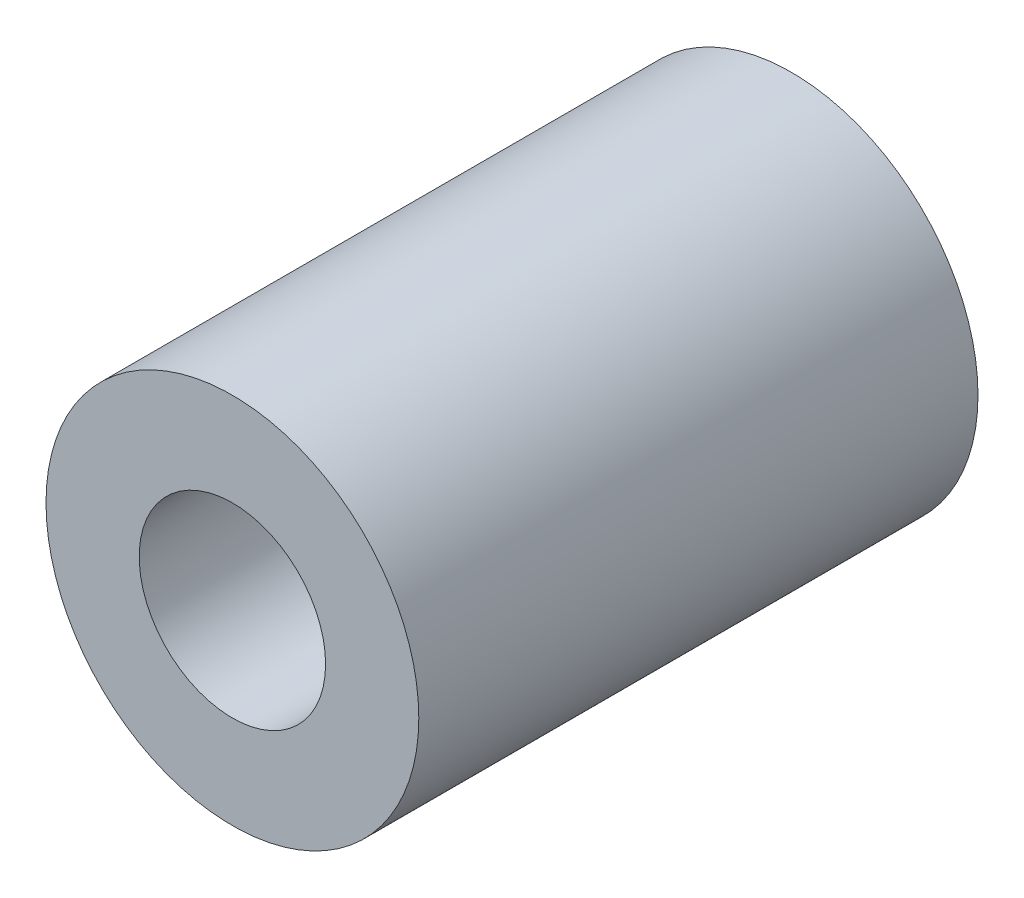
ISO-10303-21;
HEADER;
FILE_DESCRIPTION(('STEP AP214'),'2;1');
FILE_NAME('part.step','',(''),(''),'','','');
FILE_SCHEMA(('AUTOMOTIVE_DESIGN { 1 0 10303 214 1 1 1 1 }'));
ENDSEC;
DATA;
#1=APPLICATION_CONTEXT('core data for automotive mechanical design processes');
#2=APPLICATION_PROTOCOL_DEFINITION('international standard','automotive_design',2000,#1);
#3=PRODUCT_CONTEXT('',#1,'mechanical');
#4=PRODUCT('Part','Part','',(#3));
#5=PRODUCT_RELATED_PRODUCT_CATEGORY('part','',(#4));
#6=PRODUCT_DEFINITION_FORMATION('','',#4);
#7=PRODUCT_DEFINITION_CONTEXT('part definition',#1,'design');
#8=PRODUCT_DEFINITION('design','',#6,#7);
#9=PRODUCT_DEFINITION_SHAPE('','',#8);
#10=(LENGTH_UNIT() NAMED_UNIT(*) SI_UNIT(.MILLI.,.METRE.));
#11=(NAMED_UNIT(*) PLANE_ANGLE_UNIT() SI_UNIT($,.RADIAN.));
#12=(NAMED_UNIT(*) SI_UNIT($,.STERADIAN.) SOLID_ANGLE_UNIT());
#13=UNCERTAINTY_MEASURE_WITH_UNIT(LENGTH_MEASURE(1.E-05),#10,'distance_accuracy_value','');
#14=(GEOMETRIC_REPRESENTATION_CONTEXT(3) GLOBAL_UNCERTAINTY_ASSIGNED_CONTEXT((#13)) GLOBAL_UNIT_ASSIGNED_CONTEXT((#10,
#11,#12)) REPRESENTATION_CONTEXT('',''));
#15=CARTESIAN_POINT('',(0.,0.,0.));
#16=DIRECTION('',(0.,0.,1.));
#17=DIRECTION('',(1.,0.,0.));
#18=AXIS2_PLACEMENT_3D('',#15,#16,#17);
#19=CARTESIAN_POINT('',(0.,0.,15.));
#20=DIRECTION('',(0.,0.,-1.));
#21=DIRECTION('',(-1.,0.,0.));
#22=AXIS2_PLACEMENT_3D('',#19,#20,#21);
#23=CYLINDRICAL_SURFACE('',#22,5.);
#24=CARTESIAN_POINT('',(0.,0.,15.));
#25=DIRECTION('',(0.,0.,1.));
#26=DIRECTION('',(1.,0.,0.));
#27=AXIS2_PLACEMENT_3D('',#24,#25,#26);
#28=CIRCLE('',#27,5.);
#29=CARTESIAN_POINT('',(5.,0.,15.));
#30=VERTEX_POINT('',#29);
#31=EDGE_CURVE('E10',#30,#30,#28,.T.);
#32=ORIENTED_EDGE('',*,*,#31,.F.);
#33=EDGE_LOOP('',(#32));
#34=FACE_BOUND('',#33,.T.);
#35=CARTESIAN_POINT('',(0.,0.,0.));
#36=DIRECTION('',(0.,0.,1.));
#37=DIRECTION('',(1.,0.,0.));
#38=AXIS2_PLACEMENT_3D('',#35,#36,#37);
#39=CIRCLE('',#38,5.);
#40=CARTESIAN_POINT('',(5.,0.,0.));
#41=VERTEX_POINT('',#40);
#42=EDGE_CURVE('E40',#41,#41,#39,.T.);
#43=ORIENTED_EDGE('',*,*,#42,.T.);
#44=EDGE_LOOP('',(#43));
#45=FACE_BOUND('',#44,.T.);
#46=ADVANCED_FACE('F37',(#34,#45),#23,.T.);
#47=CARTESIAN_POINT('',(0.,0.,15.));
#48=DIRECTION('',(0.,0.,1.));
#49=DIRECTION('',(1.,0.,0.));
#50=AXIS2_PLACEMENT_3D('',#47,#48,#49);
#51=PLANE('',#50);
#52=CARTESIAN_POINT('',(0.,0.,15.));
#53=DIRECTION('',(0.,0.,1.));
#54=DIRECTION('',(1.,0.,0.));
#55=AXIS2_PLACEMENT_3D('',#52,#53,#54);
#56=CIRCLE('',#55,2.5);
#57=CARTESIAN_POINT('',(2.5,0.,15.));
#58=VERTEX_POINT('',#57);
#59=EDGE_CURVE('E49',#58,#58,#56,.T.);
#60=ORIENTED_EDGE('',*,*,#59,.F.);
#61=EDGE_LOOP('',(#60));
#62=FACE_BOUND('',#61,.T.);
#63=ORIENTED_EDGE('',*,*,#31,.T.);
#64=EDGE_LOOP('',(#63));
#65=FACE_BOUND('',#64,.T.);
#66=ADVANCED_FACE('F64',(#62,#65),#51,.T.);
#67=CARTESIAN_POINT('',(0.,0.,0.));
#68=DIRECTION('',(0.,0.,1.));
#69=DIRECTION('',(1.,0.,0.));
#70=AXIS2_PLACEMENT_3D('',#67,#68,#69);
#71=PLANE('',#70);
#72=ORIENTED_EDGE('',*,*,#42,.F.);
#73=EDGE_LOOP('',(#72));
#74=FACE_BOUND('',#73,.T.);
#75=ADVANCED_FACE('F60',(#74),#71,.F.);
#76=CARTESIAN_POINT('',(0.,0.,11.));
#77=DIRECTION('',(0.,0.,1.));
#78=DIRECTION('',(1.,0.,0.));
#79=AXIS2_PLACEMENT_3D('',#76,#77,#78);
#80=CYLINDRICAL_SURFACE('',#79,2.5);
#81=CARTESIAN_POINT('',(0.,0.,11.));
#82=DIRECTION('',(0.,0.,1.));
#83=DIRECTION('',(1.,0.,0.));
#84=AXIS2_PLACEMENT_3D('',#81,#82,#83);
#85=CIRCLE('',#84,2.5);
#86=CARTESIAN_POINT('',(2.5,0.,11.));
#87=VERTEX_POINT('',#86);
#88=EDGE_CURVE('E47',#87,#87,#85,.T.);
#89=ORIENTED_EDGE('',*,*,#88,.F.);
#90=EDGE_LOOP('',(#89));
#91=FACE_BOUND('',#90,.T.);
#92=ORIENTED_EDGE('',*,*,#59,.T.);
#93=EDGE_LOOP('',(#92));
#94=FACE_BOUND('',#93,.T.);
#95=ADVANCED_FACE('F57',(#91,#94),#80,.F.);
#96=CARTESIAN_POINT('',(0.,0.,11.));
#97=DIRECTION('',(0.,0.,1.));
#98=DIRECTION('',(1.,0.,0.));
#99=AXIS2_PLACEMENT_3D('',#96,#97,#98);
#100=PLANE('',#99);
#101=ORIENTED_EDGE('',*,*,#88,.T.);
#102=EDGE_LOOP('',(#101));
#103=FACE_BOUND('',#102,.T.);
#104=ADVANCED_FACE('F55',(#103),#100,.T.);
#105=CLOSED_SHELL('',(#46,#66,#75,#95,#104));
#106=MANIFOLD_SOLID_BREP('B2',#105);
#107=ADVANCED_BREP_SHAPE_REPRESENTATION('',(#18,#106),#14);
#108=SHAPE_DEFINITION_REPRESENTATION(#9,#107);
ENDSEC;
END-ISO-10303-21;
